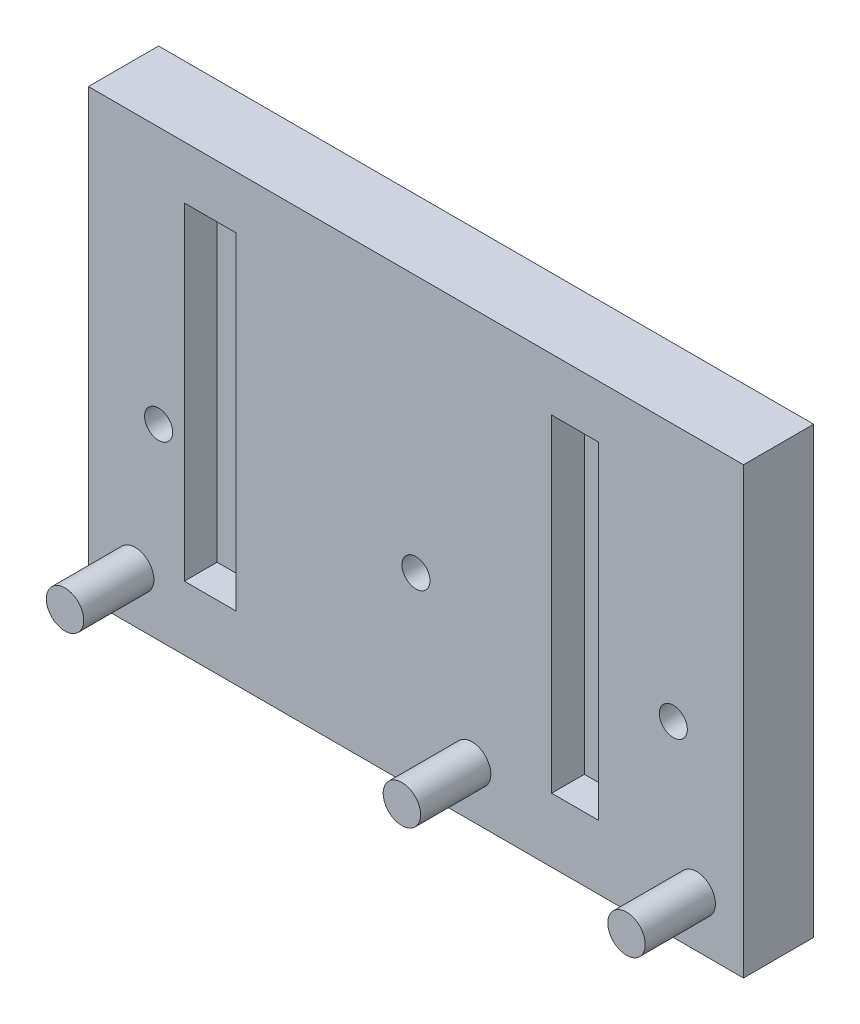
ISO-10303-21;
HEADER;
FILE_DESCRIPTION(('STEP AP214'),'2;1');
FILE_NAME('part.step','',(''),(''),'','','');
FILE_SCHEMA(('AUTOMOTIVE_DESIGN { 1 0 10303 214 1 1 1 1 }'));
ENDSEC;
DATA;
#1=APPLICATION_CONTEXT('core data for automotive mechanical design processes');
#2=APPLICATION_PROTOCOL_DEFINITION('international standard','automotive_design',2000,#1);
#3=PRODUCT_CONTEXT('',#1,'mechanical');
#4=PRODUCT('Part','Part','',(#3));
#5=PRODUCT_RELATED_PRODUCT_CATEGORY('part','',(#4));
#6=PRODUCT_DEFINITION_FORMATION('','',#4);
#7=PRODUCT_DEFINITION_CONTEXT('part definition',#1,'design');
#8=PRODUCT_DEFINITION('design','',#6,#7);
#9=PRODUCT_DEFINITION_SHAPE('','',#8);
#10=(LENGTH_UNIT() NAMED_UNIT(*) SI_UNIT(.MILLI.,.METRE.));
#11=(NAMED_UNIT(*) PLANE_ANGLE_UNIT() SI_UNIT($,.RADIAN.));
#12=(NAMED_UNIT(*) SI_UNIT($,.STERADIAN.) SOLID_ANGLE_UNIT());
#13=UNCERTAINTY_MEASURE_WITH_UNIT(LENGTH_MEASURE(1.E-05),#10,'distance_accuracy_value','');
#14=(GEOMETRIC_REPRESENTATION_CONTEXT(3) GLOBAL_UNCERTAINTY_ASSIGNED_CONTEXT((#13)) GLOBAL_UNIT_ASSIGNED_CONTEXT((#10,
#11,#12)) REPRESENTATION_CONTEXT('',''));
#15=CARTESIAN_POINT('',(0.,0.,0.));
#16=DIRECTION('',(0.,0.,1.));
#17=DIRECTION('',(1.,0.,0.));
#18=AXIS2_PLACEMENT_3D('',#15,#16,#17);
#19=CARTESIAN_POINT('',(0.,0.,0.));
#20=DIRECTION('',(0.,0.,1.));
#21=DIRECTION('',(1.,0.,0.));
#22=AXIS2_PLACEMENT_3D('',#19,#20,#21);
#23=PLANE('',#22);
#24=DIRECTION('',(1.,0.,0.));
#25=VECTOR('',#24,1.);
#26=CARTESIAN_POINT('',(0.,-913.643310138051,0.));
#27=LINE('',#26,#25);
#28=CARTESIAN_POINT('',(98.1838883110024,-913.643310138051,0.));
#29=VERTEX_POINT('',#28);
#30=CARTESIAN_POINT('',(109.183888311002,-913.643310138051,0.));
#31=VERTEX_POINT('',#30);
#32=EDGE_CURVE('E60',#29,#31,#27,.T.);
#33=ORIENTED_EDGE('',*,*,#32,.F.);
#34=DIRECTION('',(0.,1.,0.));
#35=VECTOR('',#34,1.);
#36=CARTESIAN_POINT('',(98.1838883110024,0.,0.));
#37=LINE('',#36,#35);
#38=CARTESIAN_POINT('',(98.1838883110024,-843.643310138051,0.));
#39=VERTEX_POINT('',#38);
#40=EDGE_CURVE('E168',#29,#39,#37,.T.);
#41=ORIENTED_EDGE('',*,*,#40,.T.);
#42=DIRECTION('',(1.,0.,0.));
#43=VECTOR('',#42,1.);
#44=CARTESIAN_POINT('',(0.,-843.643310138051,0.));
#45=LINE('',#44,#43);
#46=CARTESIAN_POINT('',(109.183888311002,-843.643310138051,0.));
#47=VERTEX_POINT('',#46);
#48=EDGE_CURVE('E180',#39,#47,#45,.T.);
#49=ORIENTED_EDGE('',*,*,#48,.T.);
#50=DIRECTION('',(0.,1.,0.));
#51=VECTOR('',#50,1.);
#52=CARTESIAN_POINT('',(109.183888311002,0.,0.));
#53=LINE('',#52,#51);
#54=EDGE_CURVE('E177',#31,#47,#53,.T.);
#55=ORIENTED_EDGE('',*,*,#54,.F.);
#56=EDGE_LOOP('',(#33,#41,#49,#55));
#57=FACE_BOUND('',#56,.T.);
#58=CARTESIAN_POINT('',(92.6838883110024,-887.343310138051,0.));
#59=DIRECTION('',(0.,0.,1.));
#60=DIRECTION('',(1.,0.,0.));
#61=AXIS2_PLACEMENT_3D('',#58,#59,#60);
#62=CIRCLE('',#61,3.00000000000001);
#63=CARTESIAN_POINT('',(95.6838883110024,-887.343310138051,0.));
#64=VERTEX_POINT('',#63);
#65=EDGE_CURVE('E193',#64,#64,#62,.T.);
#66=ORIENTED_EDGE('',*,*,#65,.F.);
#67=EDGE_LOOP('',(#66));
#68=FACE_BOUND('',#67,.T.);
#69=CARTESIAN_POINT('',(202.683888311002,-887.343310138051,0.));
#70=DIRECTION('',(0.,0.,1.));
#71=DIRECTION('',(1.,0.,0.));
#72=AXIS2_PLACEMENT_3D('',#69,#70,#71);
#73=CIRCLE('',#72,2.99999999999999);
#74=CARTESIAN_POINT('',(205.683888311002,-887.343310138051,0.));
#75=VERTEX_POINT('',#74);
#76=EDGE_CURVE('E199',#75,#75,#73,.T.);
#77=ORIENTED_EDGE('',*,*,#76,.F.);
#78=EDGE_LOOP('',(#77));
#79=FACE_BOUND('',#78,.T.);
#80=CARTESIAN_POINT('',(147.683888311002,-887.343310138051,0.));
#81=DIRECTION('',(0.,0.,1.));
#82=DIRECTION('',(1.,0.,0.));
#83=AXIS2_PLACEMENT_3D('',#80,#81,#82);
#84=CIRCLE('',#83,2.99999999999999);
#85=CARTESIAN_POINT('',(150.683888311002,-887.343310138051,0.));
#86=VERTEX_POINT('',#85);
#87=EDGE_CURVE('E202',#86,#86,#84,.T.);
#88=ORIENTED_EDGE('',*,*,#87,.F.);
#89=EDGE_LOOP('',(#88));
#90=FACE_BOUND('',#89,.T.);
#91=DIRECTION('',(0.,1.,0.));
#92=VECTOR('',#91,1.);
#93=CARTESIAN_POINT('',(77.6838883110024,0.,0.));
#94=LINE('',#93,#92);
#95=CARTESIAN_POINT('',(77.6838883110024,-927.343310138051,0.));
#96=VERTEX_POINT('',#95);
#97=CARTESIAN_POINT('',(77.6838883110024,-832.343310138051,0.));
#98=VERTEX_POINT('',#97);
#99=EDGE_CURVE('E219',#96,#98,#94,.T.);
#100=ORIENTED_EDGE('',*,*,#99,.F.);
#101=DIRECTION('',(1.,0.,0.));
#102=VECTOR('',#101,1.);
#103=CARTESIAN_POINT('',(0.,-927.343310138051,0.));
#104=LINE('',#103,#102);
#105=CARTESIAN_POINT('',(217.683888311002,-927.343310138051,0.));
#106=VERTEX_POINT('',#105);
#107=EDGE_CURVE('E234',#96,#106,#104,.T.);
#108=ORIENTED_EDGE('',*,*,#107,.T.);
#109=DIRECTION('',(0.,1.,0.));
#110=VECTOR('',#109,1.);
#111=CARTESIAN_POINT('',(217.683888311002,0.,0.));
#112=LINE('',#111,#110);
#113=CARTESIAN_POINT('',(217.683888311002,-832.343310138051,0.));
#114=VERTEX_POINT('',#113);
#115=EDGE_CURVE('E237',#106,#114,#112,.T.);
#116=ORIENTED_EDGE('',*,*,#115,.T.);
#117=DIRECTION('',(1.,0.,0.));
#118=VECTOR('',#117,1.);
#119=CARTESIAN_POINT('',(0.,-832.343310138051,0.));
#120=LINE('',#119,#118);
#121=EDGE_CURVE('E240',#98,#114,#120,.T.);
#122=ORIENTED_EDGE('',*,*,#121,.F.);
#123=EDGE_LOOP('',(#100,#108,#116,#122));
#124=FACE_BOUND('',#123,.T.);
#125=CARTESIAN_POINT('',(207.683888311002,-916.643310138051,0.));
#126=DIRECTION('',(0.,0.,1.));
#127=DIRECTION('',(1.,0.,0.));
#128=AXIS2_PLACEMENT_3D('',#125,#126,#127);
#129=CIRCLE('',#128,3.99999999999999);
#130=CARTESIAN_POINT('',(211.683888311002,-916.643310138051,0.));
#131=VERTEX_POINT('',#130);
#132=EDGE_CURVE('E243',#131,#131,#129,.T.);
#133=ORIENTED_EDGE('',*,*,#132,.F.);
#134=EDGE_LOOP('',(#133));
#135=FACE_BOUND('',#134,.T.);
#136=CARTESIAN_POINT('',(159.683888311002,-916.643310138051,0.));
#137=DIRECTION('',(0.,0.,1.));
#138=DIRECTION('',(1.,0.,0.));
#139=AXIS2_PLACEMENT_3D('',#136,#137,#138);
#140=CIRCLE('',#139,3.99999999999999);
#141=CARTESIAN_POINT('',(163.683888311002,-916.643310138051,0.));
#142=VERTEX_POINT('',#141);
#143=EDGE_CURVE('E246',#142,#142,#140,.T.);
#144=ORIENTED_EDGE('',*,*,#143,.F.);
#145=EDGE_LOOP('',(#144));
#146=FACE_BOUND('',#145,.T.);
#147=CARTESIAN_POINT('',(87.6838883110024,-916.643310138051,0.));
#148=DIRECTION('',(0.,0.,1.));
#149=DIRECTION('',(1.,0.,0.));
#150=AXIS2_PLACEMENT_3D('',#147,#148,#149);
#151=CIRCLE('',#150,4.00000000000001);
#152=CARTESIAN_POINT('',(91.6838883110024,-916.643310138051,0.));
#153=VERTEX_POINT('',#152);
#154=EDGE_CURVE('E224',#153,#153,#151,.T.);
#155=ORIENTED_EDGE('',*,*,#154,.F.);
#156=EDGE_LOOP('',(#155));
#157=FACE_BOUND('',#156,.T.);
#158=DIRECTION('',(-1.,0.,0.));
#159=VECTOR('',#158,1.);
#160=CARTESIAN_POINT('',(0.,-913.643310138051,0.));
#161=LINE('',#160,#159);
#162=CARTESIAN_POINT('',(186.683888311002,-913.643310138051,0.));
#163=VERTEX_POINT('',#162);
#164=CARTESIAN_POINT('',(176.683888311002,-913.643310138051,0.));
#165=VERTEX_POINT('',#164);
#166=EDGE_CURVE('E155',#163,#165,#161,.T.);
#167=ORIENTED_EDGE('',*,*,#166,.T.);
#168=DIRECTION('',(0.,1.,0.));
#169=VECTOR('',#168,1.);
#170=CARTESIAN_POINT('',(176.683888311002,0.,0.));
#171=LINE('',#170,#169);
#172=CARTESIAN_POINT('',(176.683888311002,-843.643310138051,0.));
#173=VERTEX_POINT('',#172);
#174=EDGE_CURVE('E52',#165,#173,#171,.T.);
#175=ORIENTED_EDGE('',*,*,#174,.T.);
#176=DIRECTION('',(-1.,0.,0.));
#177=VECTOR('',#176,1.);
#178=CARTESIAN_POINT('',(0.,-843.643310138051,0.));
#179=LINE('',#178,#177);
#180=CARTESIAN_POINT('',(186.683888311002,-843.643310138051,0.));
#181=VERTEX_POINT('',#180);
#182=EDGE_CURVE('E146',#181,#173,#179,.T.);
#183=ORIENTED_EDGE('',*,*,#182,.F.);
#184=DIRECTION('',(0.,1.,0.));
#185=VECTOR('',#184,1.);
#186=CARTESIAN_POINT('',(186.683888311002,0.,0.));
#187=LINE('',#186,#185);
#188=EDGE_CURVE('E149',#163,#181,#187,.T.);
#189=ORIENTED_EDGE('',*,*,#188,.F.);
#190=EDGE_LOOP('',(#167,#175,#183,#189));
#191=FACE_BOUND('',#190,.T.);
#192=ADVANCED_FACE('F35',(#57,#68,#79,#90,#124,#135,#146,#157,#191),#23,.T.);
#193=CARTESIAN_POINT('',(77.6838883110024,0.,-15.));
#194=DIRECTION('',(1.,0.,0.));
#195=DIRECTION('',(0.,0.,-1.));
#196=AXIS2_PLACEMENT_3D('',#193,#194,#195);
#197=PLANE('',#196);
#198=ORIENTED_EDGE('',*,*,#99,.T.);
#199=DIRECTION('',(0.,0.,1.));
#200=VECTOR('',#199,1.);
#201=CARTESIAN_POINT('',(77.6838883110024,-832.343310138051,-15.));
#202=LINE('',#201,#200);
#203=CARTESIAN_POINT('',(77.6838883110024,-832.343310138051,-15.));
#204=VERTEX_POINT('',#203);
#205=EDGE_CURVE('E11',#204,#98,#202,.T.);
#206=ORIENTED_EDGE('',*,*,#205,.F.);
#207=DIRECTION('',(0.,1.,0.));
#208=VECTOR('',#207,1.);
#209=CARTESIAN_POINT('',(77.6838883110024,0.,-15.));
#210=LINE('',#209,#208);
#211=CARTESIAN_POINT('',(77.6838883110024,-927.343310138051,-15.));
#212=VERTEX_POINT('',#211);
#213=EDGE_CURVE('E220',#212,#204,#210,.T.);
#214=ORIENTED_EDGE('',*,*,#213,.F.);
#215=DIRECTION('',(0.,0.,1.));
#216=VECTOR('',#215,1.);
#217=CARTESIAN_POINT('',(77.6838883110024,-927.343310138051,-15.));
#218=LINE('',#217,#216);
#219=EDGE_CURVE('E39',#212,#96,#218,.T.);
#220=ORIENTED_EDGE('',*,*,#219,.T.);
#221=EDGE_LOOP('',(#198,#206,#214,#220));
#222=FACE_BOUND('',#221,.T.);
#223=ADVANCED_FACE('F37',(#222),#197,.F.);
#224=CARTESIAN_POINT('',(0.,-832.343310138051,-15.));
#225=DIRECTION('',(0.,-1.,0.));
#226=DIRECTION('',(0.,0.,-1.));
#227=AXIS2_PLACEMENT_3D('',#224,#225,#226);
#228=PLANE('',#227);
#229=ORIENTED_EDGE('',*,*,#121,.T.);
#230=DIRECTION('',(0.,0.,1.));
#231=VECTOR('',#230,1.);
#232=CARTESIAN_POINT('',(217.683888311002,-832.343310138051,-15.));
#233=LINE('',#232,#231);
#234=CARTESIAN_POINT('',(217.683888311002,-832.343310138051,-15.));
#235=VERTEX_POINT('',#234);
#236=EDGE_CURVE('E44',#235,#114,#233,.T.);
#237=ORIENTED_EDGE('',*,*,#236,.F.);
#238=DIRECTION('',(1.,0.,0.));
#239=VECTOR('',#238,1.);
#240=CARTESIAN_POINT('',(0.,-832.343310138051,-15.));
#241=LINE('',#240,#239);
#242=EDGE_CURVE('E230',#204,#235,#241,.T.);
#243=ORIENTED_EDGE('',*,*,#242,.F.);
#244=ORIENTED_EDGE('',*,*,#205,.T.);
#245=EDGE_LOOP('',(#229,#237,#243,#244));
#246=FACE_BOUND('',#245,.T.);
#247=ADVANCED_FACE('F273',(#246),#228,.F.);
#248=CARTESIAN_POINT('',(217.683888311002,0.,-15.));
#249=DIRECTION('',(1.,0.,0.));
#250=DIRECTION('',(0.,0.,-1.));
#251=AXIS2_PLACEMENT_3D('',#248,#249,#250);
#252=PLANE('',#251);
#253=ORIENTED_EDGE('',*,*,#115,.F.);
#254=DIRECTION('',(0.,0.,1.));
#255=VECTOR('',#254,1.);
#256=CARTESIAN_POINT('',(217.683888311002,-927.343310138051,-15.));
#257=LINE('',#256,#255);
#258=CARTESIAN_POINT('',(217.683888311002,-927.343310138051,-15.));
#259=VERTEX_POINT('',#258);
#260=EDGE_CURVE('E251',#259,#106,#257,.T.);
#261=ORIENTED_EDGE('',*,*,#260,.F.);
#262=DIRECTION('',(0.,1.,0.));
#263=VECTOR('',#262,1.);
#264=CARTESIAN_POINT('',(217.683888311002,0.,-15.));
#265=LINE('',#264,#263);
#266=EDGE_CURVE('E227',#259,#235,#265,.T.);
#267=ORIENTED_EDGE('',*,*,#266,.T.);
#268=ORIENTED_EDGE('',*,*,#236,.T.);
#269=EDGE_LOOP('',(#253,#261,#267,#268));
#270=FACE_BOUND('',#269,.T.);
#271=ADVANCED_FACE('F265',(#270),#252,.T.);
#272=CARTESIAN_POINT('',(0.,-927.343310138051,-15.));
#273=DIRECTION('',(0.,-1.,0.));
#274=DIRECTION('',(0.,0.,-1.));
#275=AXIS2_PLACEMENT_3D('',#272,#273,#274);
#276=PLANE('',#275);
#277=ORIENTED_EDGE('',*,*,#107,.F.);
#278=ORIENTED_EDGE('',*,*,#219,.F.);
#279=DIRECTION('',(1.,0.,0.));
#280=VECTOR('',#279,1.);
#281=CARTESIAN_POINT('',(0.,-927.343310138051,-15.));
#282=LINE('',#281,#280);
#283=EDGE_CURVE('E223',#212,#259,#282,.T.);
#284=ORIENTED_EDGE('',*,*,#283,.T.);
#285=ORIENTED_EDGE('',*,*,#260,.T.);
#286=EDGE_LOOP('',(#277,#278,#284,#285));
#287=FACE_BOUND('',#286,.T.);
#288=ADVANCED_FACE('F262',(#287),#276,.T.);
#289=CARTESIAN_POINT('',(0.,0.,-15.));
#290=DIRECTION('',(0.,0.,1.));
#291=DIRECTION('',(1.,0.,0.));
#292=AXIS2_PLACEMENT_3D('',#289,#290,#291);
#293=PLANE('',#292);
#294=CARTESIAN_POINT('',(92.6838883110024,-887.343310138051,-15.));
#295=DIRECTION('',(0.,0.,1.));
#296=DIRECTION('',(1.,0.,0.));
#297=AXIS2_PLACEMENT_3D('',#294,#295,#296);
#298=CIRCLE('',#297,3.00000000000001);
#299=CARTESIAN_POINT('',(95.6838883110024,-887.343310138051,-15.));
#300=VERTEX_POINT('',#299);
#301=EDGE_CURVE('E187',#300,#300,#298,.T.);
#302=ORIENTED_EDGE('',*,*,#301,.T.);
#303=EDGE_LOOP('',(#302));
#304=FACE_BOUND('',#303,.T.);
#305=CARTESIAN_POINT('',(202.683888311002,-887.343310138051,-15.));
#306=DIRECTION('',(0.,0.,1.));
#307=DIRECTION('',(1.,0.,0.));
#308=AXIS2_PLACEMENT_3D('',#305,#306,#307);
#309=CIRCLE('',#308,2.99999999999999);
#310=CARTESIAN_POINT('',(205.683888311002,-887.343310138051,-15.));
#311=VERTEX_POINT('',#310);
#312=EDGE_CURVE('E196',#311,#311,#309,.T.);
#313=ORIENTED_EDGE('',*,*,#312,.T.);
#314=EDGE_LOOP('',(#313));
#315=FACE_BOUND('',#314,.T.);
#316=CARTESIAN_POINT('',(147.683888311002,-887.343310138051,-15.));
#317=DIRECTION('',(0.,0.,1.));
#318=DIRECTION('',(1.,0.,0.));
#319=AXIS2_PLACEMENT_3D('',#316,#317,#318);
#320=CIRCLE('',#319,2.99999999999999);
#321=CARTESIAN_POINT('',(150.683888311002,-887.343310138051,-15.));
#322=VERTEX_POINT('',#321);
#323=EDGE_CURVE('E205',#322,#322,#320,.T.);
#324=ORIENTED_EDGE('',*,*,#323,.T.);
#325=EDGE_LOOP('',(#324));
#326=FACE_BOUND('',#325,.T.);
#327=ORIENTED_EDGE('',*,*,#213,.T.);
#328=ORIENTED_EDGE('',*,*,#242,.T.);
#329=ORIENTED_EDGE('',*,*,#266,.F.);
#330=ORIENTED_EDGE('',*,*,#283,.F.);
#331=EDGE_LOOP('',(#327,#328,#329,#330));
#332=FACE_BOUND('',#331,.T.);
#333=ADVANCED_FACE('F264',(#304,#315,#326,#332),#293,.F.);
#334=CARTESIAN_POINT('',(87.6838883110024,-916.643310138051,15.));
#335=DIRECTION('',(0.,0.,1.));
#336=DIRECTION('',(1.,0.,0.));
#337=AXIS2_PLACEMENT_3D('',#334,#335,#336);
#338=PLANE('',#337);
#339=CARTESIAN_POINT('',(87.6838883110024,-916.643310138051,15.));
#340=DIRECTION('',(0.,0.,1.));
#341=DIRECTION('',(1.,0.,0.));
#342=AXIS2_PLACEMENT_3D('',#339,#340,#341);
#343=CIRCLE('',#342,4.00000000000001);
#344=CARTESIAN_POINT('',(91.6838883110024,-916.643310138051,15.));
#345=VERTEX_POINT('',#344);
#346=EDGE_CURVE('E216',#345,#345,#343,.T.);
#347=ORIENTED_EDGE('',*,*,#346,.T.);
#348=EDGE_LOOP('',(#347));
#349=FACE_BOUND('',#348,.T.);
#350=ADVANCED_FACE('F270',(#349),#338,.T.);
#351=CARTESIAN_POINT('',(87.6838883110024,-916.643310138051,-15.));
#352=DIRECTION('',(0.,0.,1.));
#353=DIRECTION('',(1.,0.,0.));
#354=AXIS2_PLACEMENT_3D('',#351,#352,#353);
#355=CYLINDRICAL_SURFACE('',#354,4.00000000000001);
#356=ORIENTED_EDGE('',*,*,#154,.T.);
#357=EDGE_LOOP('',(#356));
#358=FACE_BOUND('',#357,.T.);
#359=ORIENTED_EDGE('',*,*,#346,.F.);
#360=EDGE_LOOP('',(#359));
#361=FACE_BOUND('',#360,.T.);
#362=ADVANCED_FACE('F313',(#358,#361),#355,.T.);
#363=CARTESIAN_POINT('',(159.683888311002,-916.643310138051,15.));
#364=DIRECTION('',(0.,0.,1.));
#365=DIRECTION('',(1.,0.,0.));
#366=AXIS2_PLACEMENT_3D('',#363,#364,#365);
#367=PLANE('',#366);
#368=CARTESIAN_POINT('',(159.683888311002,-916.643310138051,15.));
#369=DIRECTION('',(0.,0.,1.));
#370=DIRECTION('',(1.,0.,0.));
#371=AXIS2_PLACEMENT_3D('',#368,#369,#370);
#372=CIRCLE('',#371,3.99999999999999);
#373=CARTESIAN_POINT('',(163.683888311002,-916.643310138051,15.));
#374=VERTEX_POINT('',#373);
#375=EDGE_CURVE('E213',#374,#374,#372,.T.);
#376=ORIENTED_EDGE('',*,*,#375,.T.);
#377=EDGE_LOOP('',(#376));
#378=FACE_BOUND('',#377,.T.);
#379=ADVANCED_FACE('F324',(#378),#367,.T.);
#380=CARTESIAN_POINT('',(159.683888311002,-916.643310138051,-15.));
#381=DIRECTION('',(0.,0.,1.));
#382=DIRECTION('',(1.,0.,0.));
#383=AXIS2_PLACEMENT_3D('',#380,#381,#382);
#384=CYLINDRICAL_SURFACE('',#383,3.99999999999999);
#385=ORIENTED_EDGE('',*,*,#143,.T.);
#386=EDGE_LOOP('',(#385));
#387=FACE_BOUND('',#386,.T.);
#388=ORIENTED_EDGE('',*,*,#375,.F.);
#389=EDGE_LOOP('',(#388));
#390=FACE_BOUND('',#389,.T.);
#391=ADVANCED_FACE('F333',(#387,#390),#384,.T.);
#392=CARTESIAN_POINT('',(207.683888311002,-916.643310138051,15.));
#393=DIRECTION('',(0.,0.,1.));
#394=DIRECTION('',(1.,0.,0.));
#395=AXIS2_PLACEMENT_3D('',#392,#393,#394);
#396=PLANE('',#395);
#397=CARTESIAN_POINT('',(207.683888311002,-916.643310138051,15.));
#398=DIRECTION('',(0.,0.,1.));
#399=DIRECTION('',(1.,0.,0.));
#400=AXIS2_PLACEMENT_3D('',#397,#398,#399);
#401=CIRCLE('',#400,3.99999999999999);
#402=CARTESIAN_POINT('',(211.683888311002,-916.643310138051,15.));
#403=VERTEX_POINT('',#402);
#404=EDGE_CURVE('E208',#403,#403,#401,.T.);
#405=ORIENTED_EDGE('',*,*,#404,.T.);
#406=EDGE_LOOP('',(#405));
#407=FACE_BOUND('',#406,.T.);
#408=ADVANCED_FACE('F343',(#407),#396,.T.);
#409=CARTESIAN_POINT('',(207.683888311002,-916.643310138051,-15.));
#410=DIRECTION('',(0.,0.,1.));
#411=DIRECTION('',(1.,0.,0.));
#412=AXIS2_PLACEMENT_3D('',#409,#410,#411);
#413=CYLINDRICAL_SURFACE('',#412,3.99999999999999);
#414=ORIENTED_EDGE('',*,*,#132,.T.);
#415=EDGE_LOOP('',(#414));
#416=FACE_BOUND('',#415,.T.);
#417=ORIENTED_EDGE('',*,*,#404,.F.);
#418=EDGE_LOOP('',(#417));
#419=FACE_BOUND('',#418,.T.);
#420=ADVANCED_FACE('F353',(#416,#419),#413,.T.);
#421=CARTESIAN_POINT('',(147.683888311002,-887.343310138051,-15.));
#422=DIRECTION('',(0.,0.,1.));
#423=DIRECTION('',(1.,0.,0.));
#424=AXIS2_PLACEMENT_3D('',#421,#422,#423);
#425=CYLINDRICAL_SURFACE('',#424,2.99999999999999);
#426=ORIENTED_EDGE('',*,*,#323,.F.);
#427=EDGE_LOOP('',(#426));
#428=FACE_BOUND('',#427,.T.);
#429=ORIENTED_EDGE('',*,*,#87,.T.);
#430=EDGE_LOOP('',(#429));
#431=FACE_BOUND('',#430,.T.);
#432=ADVANCED_FACE('F363',(#428,#431),#425,.F.);
#433=CARTESIAN_POINT('',(202.683888311002,-887.343310138051,-15.));
#434=DIRECTION('',(0.,0.,1.));
#435=DIRECTION('',(1.,0.,0.));
#436=AXIS2_PLACEMENT_3D('',#433,#434,#435);
#437=CYLINDRICAL_SURFACE('',#436,2.99999999999999);
#438=ORIENTED_EDGE('',*,*,#312,.F.);
#439=EDGE_LOOP('',(#438));
#440=FACE_BOUND('',#439,.T.);
#441=ORIENTED_EDGE('',*,*,#76,.T.);
#442=EDGE_LOOP('',(#441));
#443=FACE_BOUND('',#442,.T.);
#444=ADVANCED_FACE('F379',(#440,#443),#437,.F.);
#445=CARTESIAN_POINT('',(92.6838883110024,-887.343310138051,-15.));
#446=DIRECTION('',(0.,0.,1.));
#447=DIRECTION('',(1.,0.,0.));
#448=AXIS2_PLACEMENT_3D('',#445,#446,#447);
#449=CYLINDRICAL_SURFACE('',#448,3.00000000000001);
#450=ORIENTED_EDGE('',*,*,#301,.F.);
#451=EDGE_LOOP('',(#450));
#452=FACE_BOUND('',#451,.T.);
#453=ORIENTED_EDGE('',*,*,#65,.T.);
#454=EDGE_LOOP('',(#453));
#455=FACE_BOUND('',#454,.T.);
#456=ADVANCED_FACE('F389',(#452,#455),#449,.F.);
#457=CARTESIAN_POINT('',(0.,-913.643310138051,-7.));
#458=DIRECTION('',(0.,-1.,0.));
#459=DIRECTION('',(0.,0.,-1.));
#460=AXIS2_PLACEMENT_3D('',#457,#458,#459);
#461=PLANE('',#460);
#462=ORIENTED_EDGE('',*,*,#32,.T.);
#463=DIRECTION('',(0.,0.,1.));
#464=VECTOR('',#463,1.);
#465=CARTESIAN_POINT('',(109.183888311002,-913.643310138051,-7.));
#466=LINE('',#465,#464);
#467=CARTESIAN_POINT('',(109.183888311002,-913.643310138051,-7.));
#468=VERTEX_POINT('',#467);
#469=EDGE_CURVE('E175',#468,#31,#466,.T.);
#470=ORIENTED_EDGE('',*,*,#469,.F.);
#471=DIRECTION('',(1.,0.,0.));
#472=VECTOR('',#471,1.);
#473=CARTESIAN_POINT('',(0.,-913.643310138051,-7.));
#474=LINE('',#473,#472);
#475=CARTESIAN_POINT('',(98.1838883110024,-913.643310138051,-7.));
#476=VERTEX_POINT('',#475);
#477=EDGE_CURVE('E164',#476,#468,#474,.T.);
#478=ORIENTED_EDGE('',*,*,#477,.F.);
#479=DIRECTION('',(0.,0.,1.));
#480=VECTOR('',#479,1.);
#481=CARTESIAN_POINT('',(98.1838883110024,-913.643310138051,-7.));
#482=LINE('',#481,#480);
#483=EDGE_CURVE('E185',#476,#29,#482,.T.);
#484=ORIENTED_EDGE('',*,*,#483,.T.);
#485=EDGE_LOOP('',(#462,#470,#478,#484));
#486=FACE_BOUND('',#485,.T.);
#487=ADVANCED_FACE('F398',(#486),#461,.F.);
#488=CARTESIAN_POINT('',(98.1838883110024,0.,-7.));
#489=DIRECTION('',(1.,0.,0.));
#490=DIRECTION('',(0.,0.,-1.));
#491=AXIS2_PLACEMENT_3D('',#488,#489,#490);
#492=PLANE('',#491);
#493=ORIENTED_EDGE('',*,*,#40,.F.);
#494=ORIENTED_EDGE('',*,*,#483,.F.);
#495=DIRECTION('',(0.,1.,0.));
#496=VECTOR('',#495,1.);
#497=CARTESIAN_POINT('',(98.1838883110024,0.,-7.));
#498=LINE('',#497,#496);
#499=CARTESIAN_POINT('',(98.1838883110024,-843.643310138051,-7.));
#500=VERTEX_POINT('',#499);
#501=EDGE_CURVE('E173',#476,#500,#498,.T.);
#502=ORIENTED_EDGE('',*,*,#501,.T.);
#503=DIRECTION('',(0.,0.,1.));
#504=VECTOR('',#503,1.);
#505=CARTESIAN_POINT('',(98.1838883110024,-843.643310138051,-7.));
#506=LINE('',#505,#504);
#507=EDGE_CURVE('E188',#500,#39,#506,.T.);
#508=ORIENTED_EDGE('',*,*,#507,.T.);
#509=EDGE_LOOP('',(#493,#494,#502,#508));
#510=FACE_BOUND('',#509,.T.);
#511=ADVANCED_FACE('F415',(#510),#492,.T.);
#512=CARTESIAN_POINT('',(0.,-843.643310138051,-7.));
#513=DIRECTION('',(0.,-1.,0.));
#514=DIRECTION('',(0.,0.,-1.));
#515=AXIS2_PLACEMENT_3D('',#512,#513,#514);
#516=PLANE('',#515);
#517=ORIENTED_EDGE('',*,*,#48,.F.);
#518=ORIENTED_EDGE('',*,*,#507,.F.);
#519=DIRECTION('',(1.,0.,0.));
#520=VECTOR('',#519,1.);
#521=CARTESIAN_POINT('',(0.,-843.643310138051,-7.));
#522=LINE('',#521,#520);
#523=CARTESIAN_POINT('',(109.183888311002,-843.643310138051,-7.));
#524=VERTEX_POINT('',#523);
#525=EDGE_CURVE('E171',#500,#524,#522,.T.);
#526=ORIENTED_EDGE('',*,*,#525,.T.);
#527=DIRECTION('',(0.,0.,1.));
#528=VECTOR('',#527,1.);
#529=CARTESIAN_POINT('',(109.183888311002,-843.643310138051,-7.));
#530=LINE('',#529,#528);
#531=EDGE_CURVE('E190',#524,#47,#530,.T.);
#532=ORIENTED_EDGE('',*,*,#531,.T.);
#533=EDGE_LOOP('',(#517,#518,#526,#532));
#534=FACE_BOUND('',#533,.T.);
#535=ADVANCED_FACE('F424',(#534),#516,.T.);
#536=CARTESIAN_POINT('',(109.183888311002,0.,-7.));
#537=DIRECTION('',(1.,0.,0.));
#538=DIRECTION('',(0.,0.,-1.));
#539=AXIS2_PLACEMENT_3D('',#536,#537,#538);
#540=PLANE('',#539);
#541=ORIENTED_EDGE('',*,*,#54,.T.);
#542=ORIENTED_EDGE('',*,*,#531,.F.);
#543=DIRECTION('',(0.,1.,0.));
#544=VECTOR('',#543,1.);
#545=CARTESIAN_POINT('',(109.183888311002,0.,-7.));
#546=LINE('',#545,#544);
#547=EDGE_CURVE('E167',#468,#524,#546,.T.);
#548=ORIENTED_EDGE('',*,*,#547,.F.);
#549=ORIENTED_EDGE('',*,*,#469,.T.);
#550=EDGE_LOOP('',(#541,#542,#548,#549));
#551=FACE_BOUND('',#550,.T.);
#552=ADVANCED_FACE('F434',(#551),#540,.F.);
#553=CARTESIAN_POINT('',(0.,0.,-7.));
#554=DIRECTION('',(0.,0.,1.));
#555=DIRECTION('',(1.,0.,0.));
#556=AXIS2_PLACEMENT_3D('',#553,#554,#555);
#557=PLANE('',#556);
#558=ORIENTED_EDGE('',*,*,#477,.T.);
#559=ORIENTED_EDGE('',*,*,#547,.T.);
#560=ORIENTED_EDGE('',*,*,#525,.F.);
#561=ORIENTED_EDGE('',*,*,#501,.F.);
#562=EDGE_LOOP('',(#558,#559,#560,#561));
#563=FACE_BOUND('',#562,.T.);
#564=ADVANCED_FACE('F444',(#563),#557,.T.);
#565=CARTESIAN_POINT('',(176.683888311002,0.,-7.));
#566=DIRECTION('',(1.,0.,0.));
#567=DIRECTION('',(0.,0.,-1.));
#568=AXIS2_PLACEMENT_3D('',#565,#566,#567);
#569=PLANE('',#568);
#570=ORIENTED_EDGE('',*,*,#174,.F.);
#571=DIRECTION('',(0.,0.,1.));
#572=VECTOR('',#571,1.);
#573=CARTESIAN_POINT('',(176.683888311002,-913.643310138051,-7.));
#574=LINE('',#573,#572);
#575=CARTESIAN_POINT('',(176.683888311002,-913.643310138051,-7.));
#576=VERTEX_POINT('',#575);
#577=EDGE_CURVE('E129',#576,#165,#574,.T.);
#578=ORIENTED_EDGE('',*,*,#577,.F.);
#579=DIRECTION('',(0.,1.,0.));
#580=VECTOR('',#579,1.);
#581=CARTESIAN_POINT('',(176.683888311002,0.,-7.));
#582=LINE('',#581,#580);
#583=CARTESIAN_POINT('',(176.683888311002,-843.643310138051,-7.));
#584=VERTEX_POINT('',#583);
#585=EDGE_CURVE('E137',#576,#584,#582,.T.);
#586=ORIENTED_EDGE('',*,*,#585,.T.);
#587=DIRECTION('',(0.,0.,1.));
#588=VECTOR('',#587,1.);
#589=CARTESIAN_POINT('',(176.683888311002,-843.643310138051,-7.));
#590=LINE('',#589,#588);
#591=EDGE_CURVE('E159',#584,#173,#590,.T.);
#592=ORIENTED_EDGE('',*,*,#591,.T.);
#593=EDGE_LOOP('',(#570,#578,#586,#592));
#594=FACE_BOUND('',#593,.T.);
#595=ADVANCED_FACE('F139',(#594),#569,.T.);
#596=CARTESIAN_POINT('',(0.,-843.643310138051,-7.));
#597=DIRECTION('',(0.,1.,0.));
#598=DIRECTION('',(0.,0.,1.));
#599=AXIS2_PLACEMENT_3D('',#596,#597,#598);
#600=PLANE('',#599);
#601=ORIENTED_EDGE('',*,*,#182,.T.);
#602=ORIENTED_EDGE('',*,*,#591,.F.);
#603=DIRECTION('',(-1.,0.,0.));
#604=VECTOR('',#603,1.);
#605=CARTESIAN_POINT('',(0.,-843.643310138051,-7.));
#606=LINE('',#605,#604);
#607=CARTESIAN_POINT('',(186.683888311002,-843.643310138051,-7.));
#608=VERTEX_POINT('',#607);
#609=EDGE_CURVE('E141',#608,#584,#606,.T.);
#610=ORIENTED_EDGE('',*,*,#609,.F.);
#611=DIRECTION('',(0.,0.,1.));
#612=VECTOR('',#611,1.);
#613=CARTESIAN_POINT('',(186.683888311002,-843.643310138051,-7.));
#614=LINE('',#613,#612);
#615=EDGE_CURVE('E161',#608,#181,#614,.T.);
#616=ORIENTED_EDGE('',*,*,#615,.T.);
#617=EDGE_LOOP('',(#601,#602,#610,#616));
#618=FACE_BOUND('',#617,.T.);
#619=ADVANCED_FACE('F463',(#618),#600,.F.);
#620=CARTESIAN_POINT('',(186.683888311002,0.,-7.));
#621=DIRECTION('',(1.,0.,0.));
#622=DIRECTION('',(0.,0.,-1.));
#623=AXIS2_PLACEMENT_3D('',#620,#621,#622);
#624=PLANE('',#623);
#625=ORIENTED_EDGE('',*,*,#188,.T.);
#626=ORIENTED_EDGE('',*,*,#615,.F.);
#627=DIRECTION('',(0.,1.,0.));
#628=VECTOR('',#627,1.);
#629=CARTESIAN_POINT('',(186.683888311002,0.,-7.));
#630=LINE('',#629,#628);
#631=CARTESIAN_POINT('',(186.683888311002,-913.643310138051,-7.));
#632=VERTEX_POINT('',#631);
#633=EDGE_CURVE('E136',#632,#608,#630,.T.);
#634=ORIENTED_EDGE('',*,*,#633,.F.);
#635=DIRECTION('',(0.,0.,1.));
#636=VECTOR('',#635,1.);
#637=CARTESIAN_POINT('',(186.683888311002,-913.643310138051,-7.));
#638=LINE('',#637,#636);
#639=EDGE_CURVE('E131',#632,#163,#638,.T.);
#640=ORIENTED_EDGE('',*,*,#639,.T.);
#641=EDGE_LOOP('',(#625,#626,#634,#640));
#642=FACE_BOUND('',#641,.T.);
#643=ADVANCED_FACE('F472',(#642),#624,.F.);
#644=CARTESIAN_POINT('',(0.,-913.643310138051,-7.));
#645=DIRECTION('',(0.,1.,0.));
#646=DIRECTION('',(0.,0.,1.));
#647=AXIS2_PLACEMENT_3D('',#644,#645,#646);
#648=PLANE('',#647);
#649=ORIENTED_EDGE('',*,*,#166,.F.);
#650=ORIENTED_EDGE('',*,*,#639,.F.);
#651=DIRECTION('',(-1.,0.,0.));
#652=VECTOR('',#651,1.);
#653=CARTESIAN_POINT('',(0.,-913.643310138051,-7.));
#654=LINE('',#653,#652);
#655=EDGE_CURVE('E126',#632,#576,#654,.T.);
#656=ORIENTED_EDGE('',*,*,#655,.T.);
#657=ORIENTED_EDGE('',*,*,#577,.T.);
#658=EDGE_LOOP('',(#649,#650,#656,#657));
#659=FACE_BOUND('',#658,.T.);
#660=ADVANCED_FACE('F128',(#659),#648,.T.);
#661=CARTESIAN_POINT('',(0.,0.,-7.));
#662=DIRECTION('',(0.,0.,1.));
#663=DIRECTION('',(1.,0.,0.));
#664=AXIS2_PLACEMENT_3D('',#661,#662,#663);
#665=PLANE('',#664);
#666=ORIENTED_EDGE('',*,*,#585,.F.);
#667=ORIENTED_EDGE('',*,*,#655,.F.);
#668=ORIENTED_EDGE('',*,*,#633,.T.);
#669=ORIENTED_EDGE('',*,*,#609,.T.);
#670=EDGE_LOOP('',(#666,#667,#668,#669));
#671=FACE_BOUND('',#670,.T.);
#672=ADVANCED_FACE('F144',(#671),#665,.T.);
#673=CLOSED_SHELL('',(#192,#223,#247,#271,#288,#333,#350,#362,#379,#391,#408,#420,#432,#444,
#456,#487,#511,#535,#552,#564,#595,#619,#643,#660,#672));
#674=MANIFOLD_SOLID_BREP('B2',#673);
#675=ADVANCED_BREP_SHAPE_REPRESENTATION('',(#18,#674),#14);
#676=SHAPE_DEFINITION_REPRESENTATION(#9,#675);
ENDSEC;
END-ISO-10303-21;
